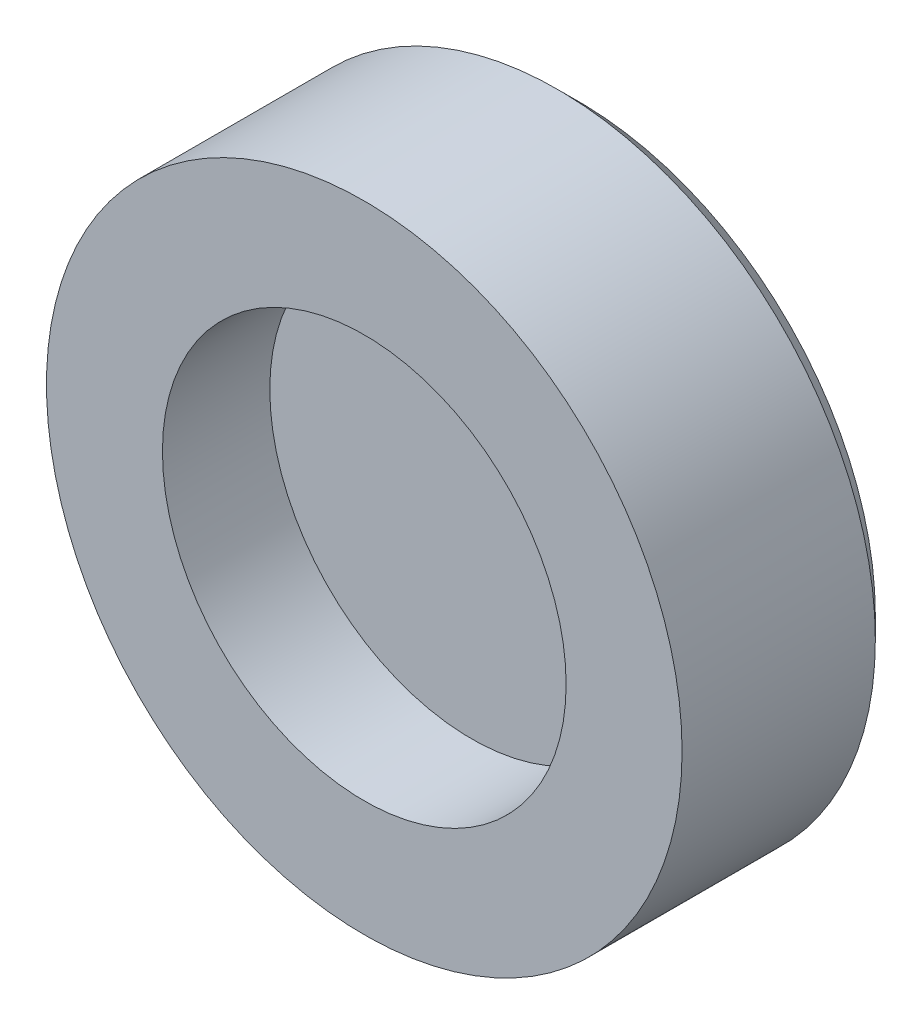
ISO-10303-21;
HEADER;
FILE_DESCRIPTION(('STEP AP214'),'2;1');
FILE_NAME('part.step','',(''),(''),'','','');
FILE_SCHEMA(('AUTOMOTIVE_DESIGN { 1 0 10303 214 1 1 1 1 }'));
ENDSEC;
DATA;
#1=APPLICATION_CONTEXT('core data for automotive mechanical design processes');
#2=APPLICATION_PROTOCOL_DEFINITION('international standard','automotive_design',2000,#1);
#3=PRODUCT_CONTEXT('',#1,'mechanical');
#4=PRODUCT('Part','Part','',(#3));
#5=PRODUCT_RELATED_PRODUCT_CATEGORY('part','',(#4));
#6=PRODUCT_DEFINITION_FORMATION('','',#4);
#7=PRODUCT_DEFINITION_CONTEXT('part definition',#1,'design');
#8=PRODUCT_DEFINITION('design','',#6,#7);
#9=PRODUCT_DEFINITION_SHAPE('','',#8);
#10=(LENGTH_UNIT() NAMED_UNIT(*) SI_UNIT(.MILLI.,.METRE.));
#11=(NAMED_UNIT(*) PLANE_ANGLE_UNIT() SI_UNIT($,.RADIAN.));
#12=(NAMED_UNIT(*) SI_UNIT($,.STERADIAN.) SOLID_ANGLE_UNIT());
#13=UNCERTAINTY_MEASURE_WITH_UNIT(LENGTH_MEASURE(1.E-05),#10,'distance_accuracy_value','');
#14=(GEOMETRIC_REPRESENTATION_CONTEXT(3) GLOBAL_UNCERTAINTY_ASSIGNED_CONTEXT((#13)) GLOBAL_UNIT_ASSIGNED_CONTEXT((#10,
#11,#12)) REPRESENTATION_CONTEXT('',''));
#15=CARTESIAN_POINT('',(0.,0.,0.));
#16=DIRECTION('',(0.,0.,1.));
#17=DIRECTION('',(1.,0.,0.));
#18=AXIS2_PLACEMENT_3D('',#15,#16,#17);
#19=CARTESIAN_POINT('',(0.,0.,16.8198076923077));
#20=DIRECTION('',(0.,0.,1.));
#21=DIRECTION('',(1.,0.,0.));
#22=AXIS2_PLACEMENT_3D('',#19,#20,#21);
#23=CYLINDRICAL_SURFACE('',#22,7.4);
#24=CARTESIAN_POINT('',(0.,0.,0.5));
#25=DIRECTION('',(0.,0.,1.));
#26=DIRECTION('',(1.,0.,0.));
#27=AXIS2_PLACEMENT_3D('',#24,#25,#26);
#28=CIRCLE('',#27,7.4);
#29=CARTESIAN_POINT('',(7.4,0.,0.5));
#30=VERTEX_POINT('',#29);
#31=EDGE_CURVE('E45',#30,#30,#28,.T.);
#32=ORIENTED_EDGE('',*,*,#31,.T.);
#33=EDGE_LOOP('',(#32));
#34=FACE_BOUND('',#33,.T.);
#35=CARTESIAN_POINT('',(0.,0.,5.));
#36=DIRECTION('',(0.,0.,1.));
#37=DIRECTION('',(1.,0.,0.));
#38=AXIS2_PLACEMENT_3D('',#35,#36,#37);
#39=CIRCLE('',#38,7.4);
#40=CARTESIAN_POINT('',(7.4,0.,5.));
#41=VERTEX_POINT('',#40);
#42=EDGE_CURVE('E61',#41,#41,#39,.T.);
#43=ORIENTED_EDGE('',*,*,#42,.F.);
#44=EDGE_LOOP('',(#43));
#45=FACE_BOUND('',#44,.T.);
#46=ADVANCED_FACE('F37',(#34,#45),#23,.T.);
#47=CARTESIAN_POINT('',(-7.4,0.,0.));
#48=DIRECTION('',(0.,0.,1.));
#49=DIRECTION('',(1.,0.,0.));
#50=AXIS2_PLACEMENT_3D('',#47,#48,#49);
#51=PLANE('',#50);
#52=CARTESIAN_POINT('',(0.,0.,0.));
#53=DIRECTION('',(0.,0.,1.));
#54=DIRECTION('',(1.,0.,0.));
#55=AXIS2_PLACEMENT_3D('',#52,#53,#54);
#56=CIRCLE('',#55,6.9);
#57=CARTESIAN_POINT('',(6.9,0.,0.));
#58=VERTEX_POINT('',#57);
#59=EDGE_CURVE('E10',#58,#58,#56,.F.);
#60=ORIENTED_EDGE('',*,*,#59,.T.);
#61=EDGE_LOOP('',(#60));
#62=FACE_BOUND('',#61,.T.);
#63=ADVANCED_FACE('F69',(#62),#51,.F.);
#64=CARTESIAN_POINT('',(-4.7,0.,2.5));
#65=DIRECTION('',(0.,0.,-1.));
#66=DIRECTION('',(-1.,0.,0.));
#67=AXIS2_PLACEMENT_3D('',#64,#65,#66);
#68=PLANE('',#67);
#69=CARTESIAN_POINT('',(0.,0.,2.5));
#70=DIRECTION('',(0.,0.,1.));
#71=DIRECTION('',(1.,0.,0.));
#72=AXIS2_PLACEMENT_3D('',#69,#70,#71);
#73=CIRCLE('',#72,4.7);
#74=CARTESIAN_POINT('',(4.7,0.,2.5));
#75=VERTEX_POINT('',#74);
#76=EDGE_CURVE('E50',#75,#75,#73,.T.);
#77=ORIENTED_EDGE('',*,*,#76,.T.);
#78=EDGE_LOOP('',(#77));
#79=FACE_BOUND('',#78,.T.);
#80=ADVANCED_FACE('F73',(#79),#68,.F.);
#81=CARTESIAN_POINT('',(0.,0.,16.8198076923077));
#82=DIRECTION('',(0.,0.,1.));
#83=DIRECTION('',(1.,0.,0.));
#84=AXIS2_PLACEMENT_3D('',#81,#82,#83);
#85=CYLINDRICAL_SURFACE('',#84,4.7);
#86=ORIENTED_EDGE('',*,*,#76,.F.);
#87=EDGE_LOOP('',(#86));
#88=FACE_BOUND('',#87,.T.);
#89=CARTESIAN_POINT('',(0.,0.,5.));
#90=DIRECTION('',(0.,0.,1.));
#91=DIRECTION('',(1.,0.,0.));
#92=AXIS2_PLACEMENT_3D('',#89,#90,#91);
#93=CIRCLE('',#92,4.7);
#94=CARTESIAN_POINT('',(4.7,0.,5.));
#95=VERTEX_POINT('',#94);
#96=EDGE_CURVE('E55',#95,#95,#93,.T.);
#97=ORIENTED_EDGE('',*,*,#96,.T.);
#98=EDGE_LOOP('',(#97));
#99=FACE_BOUND('',#98,.T.);
#100=ADVANCED_FACE('F78',(#88,#99),#85,.F.);
#101=CARTESIAN_POINT('',(-7.4,0.,5.));
#102=DIRECTION('',(0.,0.,-1.));
#103=DIRECTION('',(-1.,0.,0.));
#104=AXIS2_PLACEMENT_3D('',#101,#102,#103);
#105=PLANE('',#104);
#106=ORIENTED_EDGE('',*,*,#96,.F.);
#107=EDGE_LOOP('',(#106));
#108=FACE_BOUND('',#107,.T.);
#109=ORIENTED_EDGE('',*,*,#42,.T.);
#110=EDGE_LOOP('',(#109));
#111=FACE_BOUND('',#110,.T.);
#112=ADVANCED_FACE('F66',(#108,#111),#105,.F.);
#113=CARTESIAN_POINT('',(0.,0.,0.5));
#114=DIRECTION('',(0.,0.,1.));
#115=DIRECTION('',(1.,0.,0.));
#116=AXIS2_PLACEMENT_3D('',#113,#114,#115);
#117=CONICAL_SURFACE('',#116,7.4,0.785398163397448);
#118=ORIENTED_EDGE('',*,*,#59,.F.);
#119=EDGE_LOOP('',(#118));
#120=FACE_BOUND('',#119,.T.);
#121=ORIENTED_EDGE('',*,*,#31,.F.);
#122=EDGE_LOOP('',(#121));
#123=FACE_BOUND('',#122,.T.);
#124=ADVANCED_FACE('F39',(#120,#123),#117,.T.);
#125=CLOSED_SHELL('',(#46,#63,#80,#100,#112,#124));
#126=MANIFOLD_SOLID_BREP('B2',#125);
#127=ADVANCED_BREP_SHAPE_REPRESENTATION('',(#18,#126),#14);
#128=SHAPE_DEFINITION_REPRESENTATION(#9,#127);
ENDSEC;
END-ISO-10303-21;
